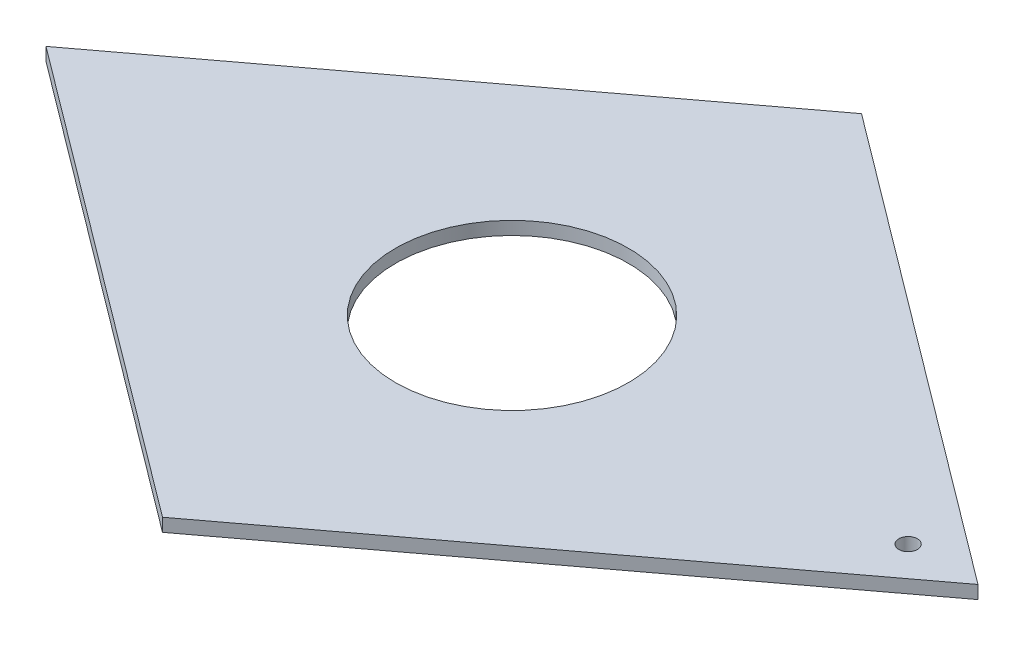
ISO-10303-21;
HEADER;
FILE_DESCRIPTION(('STEP AP214'),'2;1');
FILE_NAME('part.step','',(''),(''),'','','');
FILE_SCHEMA(('AUTOMOTIVE_DESIGN { 1 0 10303 214 1 1 1 1 }'));
ENDSEC;
DATA;
#1=APPLICATION_CONTEXT('core data for automotive mechanical design processes');
#2=APPLICATION_PROTOCOL_DEFINITION('international standard','automotive_design',2000,#1);
#3=PRODUCT_CONTEXT('',#1,'mechanical');
#4=PRODUCT('Part','Part','',(#3));
#5=PRODUCT_RELATED_PRODUCT_CATEGORY('part','',(#4));
#6=PRODUCT_DEFINITION_FORMATION('','',#4);
#7=PRODUCT_DEFINITION_CONTEXT('part definition',#1,'design');
#8=PRODUCT_DEFINITION('design','',#6,#7);
#9=PRODUCT_DEFINITION_SHAPE('','',#8);
#10=(LENGTH_UNIT() NAMED_UNIT(*) SI_UNIT(.MILLI.,.METRE.));
#11=(NAMED_UNIT(*) PLANE_ANGLE_UNIT() SI_UNIT($,.RADIAN.));
#12=(NAMED_UNIT(*) SI_UNIT($,.STERADIAN.) SOLID_ANGLE_UNIT());
#13=UNCERTAINTY_MEASURE_WITH_UNIT(LENGTH_MEASURE(1.E-05),#10,'distance_accuracy_value','');
#14=(GEOMETRIC_REPRESENTATION_CONTEXT(3) GLOBAL_UNCERTAINTY_ASSIGNED_CONTEXT((#13)) GLOBAL_UNIT_ASSIGNED_CONTEXT((#10,
#11,#12)) REPRESENTATION_CONTEXT('',''));
#15=CARTESIAN_POINT('',(0.,0.,0.));
#16=DIRECTION('',(0.,0.,1.));
#17=DIRECTION('',(1.,0.,0.));
#18=AXIS2_PLACEMENT_3D('',#15,#16,#17);
#19=CARTESIAN_POINT('',(0.,5.63,0.));
#20=DIRECTION('',(0.,-1.,0.));
#21=DIRECTION('',(0.,0.,-1.));
#22=AXIS2_PLACEMENT_3D('',#19,#20,#21);
#23=PLANE('',#22);
#24=DIRECTION('',(-0.8,0.,0.6));
#25=VECTOR('',#24,1.);
#26=CARTESIAN_POINT('',(-200.,5.63,0.));
#27=LINE('',#26,#25);
#28=CARTESIAN_POINT('',(0.,5.63,-150.));
#29=VERTEX_POINT('',#28);
#30=CARTESIAN_POINT('',(-200.,5.63,0.));
#31=VERTEX_POINT('',#30);
#32=EDGE_CURVE('E85',#29,#31,#27,.T.);
#33=ORIENTED_EDGE('',*,*,#32,.T.);
#34=DIRECTION('',(0.8,0.,0.6));
#35=VECTOR('',#34,1.);
#36=CARTESIAN_POINT('',(0.,5.63,150.));
#37=LINE('',#36,#35);
#38=CARTESIAN_POINT('',(0.,5.63,150.));
#39=VERTEX_POINT('',#38);
#40=EDGE_CURVE('E80',#31,#39,#37,.T.);
#41=ORIENTED_EDGE('',*,*,#40,.T.);
#42=DIRECTION('',(0.8,0.,-0.6));
#43=VECTOR('',#42,1.);
#44=CARTESIAN_POINT('',(200.,5.63,0.));
#45=LINE('',#44,#43);
#46=CARTESIAN_POINT('',(200.,5.63,0.));
#47=VERTEX_POINT('',#46);
#48=EDGE_CURVE('E83',#39,#47,#45,.T.);
#49=ORIENTED_EDGE('',*,*,#48,.T.);
#50=DIRECTION('',(-0.8,0.,-0.6));
#51=VECTOR('',#50,1.);
#52=CARTESIAN_POINT('',(0.,5.63,-150.));
#53=LINE('',#52,#51);
#54=EDGE_CURVE('E50',#47,#29,#53,.T.);
#55=ORIENTED_EDGE('',*,*,#54,.T.);
#56=EDGE_LOOP('',(#33,#41,#49,#55));
#57=FACE_BOUND('',#56,.T.);
#58=CARTESIAN_POINT('',(170.,5.63,0.));
#59=DIRECTION('',(0.,1.,0.));
#60=DIRECTION('',(0.,0.,1.));
#61=AXIS2_PLACEMENT_3D('',#58,#59,#60);
#62=CIRCLE('',#61,3.99999999999999);
#63=CARTESIAN_POINT('',(170.,5.63,3.99999999999999));
#64=VERTEX_POINT('',#63);
#65=EDGE_CURVE('E100',#64,#64,#62,.T.);
#66=ORIENTED_EDGE('',*,*,#65,.F.);
#67=EDGE_LOOP('',(#66));
#68=FACE_BOUND('',#67,.T.);
#69=CARTESIAN_POINT('',(0.,5.63,0.));
#70=DIRECTION('',(0.,1.,0.));
#71=DIRECTION('',(0.,0.,1.));
#72=AXIS2_PLACEMENT_3D('',#69,#70,#71);
#73=CIRCLE('',#72,50.);
#74=CARTESIAN_POINT('',(0.,5.63,50.));
#75=VERTEX_POINT('',#74);
#76=EDGE_CURVE('E115',#75,#75,#73,.T.);
#77=ORIENTED_EDGE('',*,*,#76,.F.);
#78=EDGE_LOOP('',(#77));
#79=FACE_BOUND('',#78,.T.);
#80=ADVANCED_FACE('F33',(#57,#68,#79),#23,.F.);
#81=CARTESIAN_POINT('',(0.,0.,0.));
#82=DIRECTION('',(0.,-1.,0.));
#83=DIRECTION('',(0.,0.,-1.));
#84=AXIS2_PLACEMENT_3D('',#81,#82,#83);
#85=PLANE('',#84);
#86=CARTESIAN_POINT('',(170.,0.,0.));
#87=DIRECTION('',(0.,1.,0.));
#88=DIRECTION('',(0.,0.,1.));
#89=AXIS2_PLACEMENT_3D('',#86,#87,#88);
#90=CIRCLE('',#89,3.99999999999999);
#91=CARTESIAN_POINT('',(170.,0.,3.99999999999999));
#92=VERTEX_POINT('',#91);
#93=EDGE_CURVE('E112',#92,#92,#90,.T.);
#94=ORIENTED_EDGE('',*,*,#93,.T.);
#95=EDGE_LOOP('',(#94));
#96=FACE_BOUND('',#95,.T.);
#97=DIRECTION('',(-0.8,0.,0.6));
#98=VECTOR('',#97,1.);
#99=CARTESIAN_POINT('',(-200.,0.,0.));
#100=LINE('',#99,#98);
#101=CARTESIAN_POINT('',(0.,0.,-150.));
#102=VERTEX_POINT('',#101);
#103=CARTESIAN_POINT('',(-200.,0.,0.));
#104=VERTEX_POINT('',#103);
#105=EDGE_CURVE('E97',#102,#104,#100,.T.);
#106=ORIENTED_EDGE('',*,*,#105,.F.);
#107=DIRECTION('',(-0.8,0.,-0.6));
#108=VECTOR('',#107,1.);
#109=CARTESIAN_POINT('',(0.,0.,-150.));
#110=LINE('',#109,#108);
#111=CARTESIAN_POINT('',(200.,0.,0.));
#112=VERTEX_POINT('',#111);
#113=EDGE_CURVE('E73',#112,#102,#110,.T.);
#114=ORIENTED_EDGE('',*,*,#113,.F.);
#115=DIRECTION('',(0.8,0.,-0.6));
#116=VECTOR('',#115,1.);
#117=CARTESIAN_POINT('',(200.,0.,0.));
#118=LINE('',#117,#116);
#119=CARTESIAN_POINT('',(0.,0.,150.));
#120=VERTEX_POINT('',#119);
#121=EDGE_CURVE('E67',#120,#112,#118,.T.);
#122=ORIENTED_EDGE('',*,*,#121,.F.);
#123=DIRECTION('',(0.8,0.,0.6));
#124=VECTOR('',#123,1.);
#125=CARTESIAN_POINT('',(0.,0.,150.));
#126=LINE('',#125,#124);
#127=EDGE_CURVE('E89',#104,#120,#126,.T.);
#128=ORIENTED_EDGE('',*,*,#127,.F.);
#129=EDGE_LOOP('',(#106,#114,#122,#128));
#130=FACE_BOUND('',#129,.T.);
#131=CARTESIAN_POINT('',(0.,0.,0.));
#132=DIRECTION('',(0.,1.,0.));
#133=DIRECTION('',(0.,0.,1.));
#134=AXIS2_PLACEMENT_3D('',#131,#132,#133);
#135=CIRCLE('',#134,50.);
#136=CARTESIAN_POINT('',(0.,0.,50.));
#137=VERTEX_POINT('',#136);
#138=EDGE_CURVE('E118',#137,#137,#135,.T.);
#139=ORIENTED_EDGE('',*,*,#138,.T.);
#140=EDGE_LOOP('',(#139));
#141=FACE_BOUND('',#140,.T.);
#142=ADVANCED_FACE('F108',(#96,#130,#141),#85,.T.);
#143=CARTESIAN_POINT('',(-200.,5.63,0.));
#144=DIRECTION('',(0.6,0.,0.8));
#145=DIRECTION('',(0.8,0.,-0.6));
#146=AXIS2_PLACEMENT_3D('',#143,#144,#145);
#147=PLANE('',#146);
#148=ORIENTED_EDGE('',*,*,#105,.T.);
#149=DIRECTION('',(0.,-1.,0.));
#150=VECTOR('',#149,1.);
#151=CARTESIAN_POINT('',(-200.,5.63,0.));
#152=LINE('',#151,#150);
#153=EDGE_CURVE('E11',#31,#104,#152,.T.);
#154=ORIENTED_EDGE('',*,*,#153,.F.);
#155=ORIENTED_EDGE('',*,*,#32,.F.);
#156=DIRECTION('',(0.,-1.,0.));
#157=VECTOR('',#156,1.);
#158=CARTESIAN_POINT('',(0.,5.63,-150.));
#159=LINE('',#158,#157);
#160=EDGE_CURVE('E93',#29,#102,#159,.T.);
#161=ORIENTED_EDGE('',*,*,#160,.T.);
#162=EDGE_LOOP('',(#148,#154,#155,#161));
#163=FACE_BOUND('',#162,.T.);
#164=ADVANCED_FACE('F35',(#163),#147,.F.);
#165=CARTESIAN_POINT('',(0.,5.63,150.));
#166=DIRECTION('',(0.6,0.,-0.8));
#167=DIRECTION('',(-0.8,0.,-0.6));
#168=AXIS2_PLACEMENT_3D('',#165,#166,#167);
#169=PLANE('',#168);
#170=ORIENTED_EDGE('',*,*,#127,.T.);
#171=DIRECTION('',(0.,-1.,0.));
#172=VECTOR('',#171,1.);
#173=CARTESIAN_POINT('',(0.,5.63,150.));
#174=LINE('',#173,#172);
#175=EDGE_CURVE('E42',#39,#120,#174,.T.);
#176=ORIENTED_EDGE('',*,*,#175,.F.);
#177=ORIENTED_EDGE('',*,*,#40,.F.);
#178=ORIENTED_EDGE('',*,*,#153,.T.);
#179=EDGE_LOOP('',(#170,#176,#177,#178));
#180=FACE_BOUND('',#179,.T.);
#181=ADVANCED_FACE('F88',(#180),#169,.F.);
#182=CARTESIAN_POINT('',(200.,5.63,0.));
#183=DIRECTION('',(-0.6,0.,-0.8));
#184=DIRECTION('',(-0.8,0.,0.6));
#185=AXIS2_PLACEMENT_3D('',#182,#183,#184);
#186=PLANE('',#185);
#187=ORIENTED_EDGE('',*,*,#121,.T.);
#188=DIRECTION('',(0.,-1.,0.));
#189=VECTOR('',#188,1.);
#190=CARTESIAN_POINT('',(200.,5.63,0.));
#191=LINE('',#190,#189);
#192=EDGE_CURVE('E90',#47,#112,#191,.T.);
#193=ORIENTED_EDGE('',*,*,#192,.F.);
#194=ORIENTED_EDGE('',*,*,#48,.F.);
#195=ORIENTED_EDGE('',*,*,#175,.T.);
#196=EDGE_LOOP('',(#187,#193,#194,#195));
#197=FACE_BOUND('',#196,.T.);
#198=ADVANCED_FACE('F91',(#197),#186,.F.);
#199=CARTESIAN_POINT('',(0.,5.63,-150.));
#200=DIRECTION('',(-0.6,0.,0.8));
#201=DIRECTION('',(0.8,0.,0.6));
#202=AXIS2_PLACEMENT_3D('',#199,#200,#201);
#203=PLANE('',#202);
#204=ORIENTED_EDGE('',*,*,#113,.T.);
#205=ORIENTED_EDGE('',*,*,#160,.F.);
#206=ORIENTED_EDGE('',*,*,#54,.F.);
#207=ORIENTED_EDGE('',*,*,#192,.T.);
#208=EDGE_LOOP('',(#204,#205,#206,#207));
#209=FACE_BOUND('',#208,.T.);
#210=ADVANCED_FACE('F105',(#209),#203,.F.);
#211=CARTESIAN_POINT('',(170.,5.63,0.));
#212=DIRECTION('',(0.,-1.,0.));
#213=DIRECTION('',(0.,0.,-1.));
#214=AXIS2_PLACEMENT_3D('',#211,#212,#213);
#215=CYLINDRICAL_SURFACE('',#214,3.99999999999999);
#216=ORIENTED_EDGE('',*,*,#65,.T.);
#217=EDGE_LOOP('',(#216));
#218=FACE_BOUND('',#217,.T.);
#219=ORIENTED_EDGE('',*,*,#93,.F.);
#220=EDGE_LOOP('',(#219));
#221=FACE_BOUND('',#220,.T.);
#222=ADVANCED_FACE('F135',(#218,#221),#215,.F.);
#223=CARTESIAN_POINT('',(0.,5.63,0.));
#224=DIRECTION('',(0.,-1.,0.));
#225=DIRECTION('',(0.,0.,-1.));
#226=AXIS2_PLACEMENT_3D('',#223,#224,#225);
#227=CYLINDRICAL_SURFACE('',#226,50.);
#228=ORIENTED_EDGE('',*,*,#76,.T.);
#229=EDGE_LOOP('',(#228));
#230=FACE_BOUND('',#229,.T.);
#231=ORIENTED_EDGE('',*,*,#138,.F.);
#232=EDGE_LOOP('',(#231));
#233=FACE_BOUND('',#232,.T.);
#234=ADVANCED_FACE('F124',(#230,#233),#227,.F.);
#235=CLOSED_SHELL('',(#80,#142,#164,#181,#198,#210,#222,#234));
#236=MANIFOLD_SOLID_BREP('B2',#235);
#237=ADVANCED_BREP_SHAPE_REPRESENTATION('',(#18,#236),#14);
#238=SHAPE_DEFINITION_REPRESENTATION(#9,#237);
ENDSEC;
END-ISO-10303-21;
